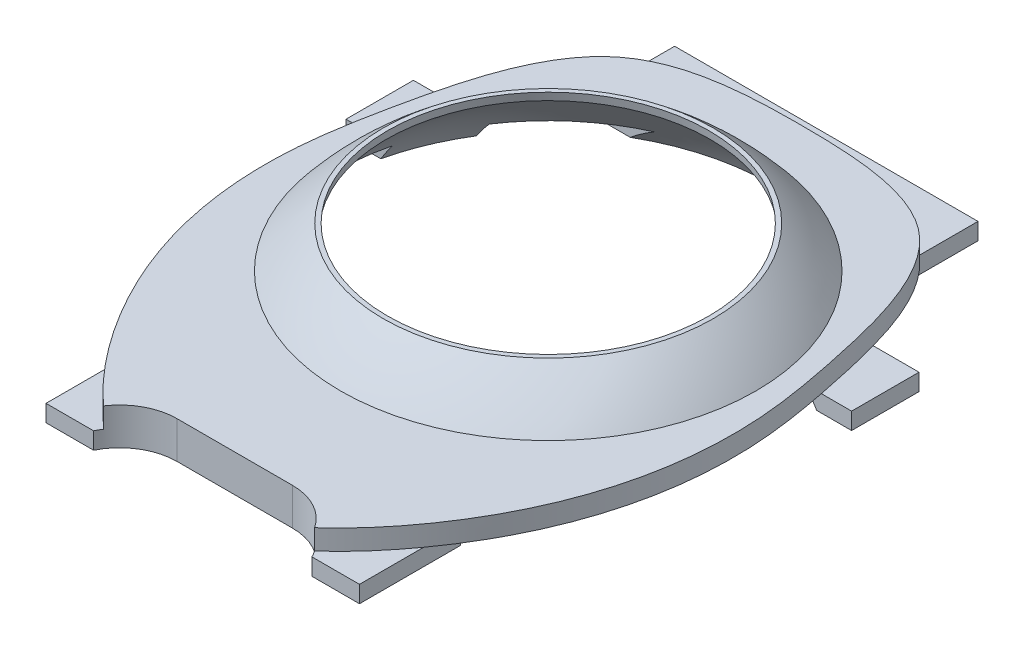
ISO-10303-21;
HEADER;
FILE_DESCRIPTION(('STEP AP214'),'2;1');
FILE_NAME('part.step','',(''),(''),'','','');
FILE_SCHEMA(('AUTOMOTIVE_DESIGN { 1 0 10303 214 1 1 1 1 }'));
ENDSEC;
DATA;
#1=APPLICATION_CONTEXT('core data for automotive mechanical design processes');
#2=APPLICATION_PROTOCOL_DEFINITION('international standard','automotive_design',2000,#1);
#3=PRODUCT_CONTEXT('',#1,'mechanical');
#4=PRODUCT('Part','Part','',(#3));
#5=PRODUCT_RELATED_PRODUCT_CATEGORY('part','',(#4));
#6=PRODUCT_DEFINITION_FORMATION('','',#4);
#7=PRODUCT_DEFINITION_CONTEXT('part definition',#1,'design');
#8=PRODUCT_DEFINITION('design','',#6,#7);
#9=PRODUCT_DEFINITION_SHAPE('','',#8);
#10=(LENGTH_UNIT() NAMED_UNIT(*) SI_UNIT(.MILLI.,.METRE.));
#11=(NAMED_UNIT(*) PLANE_ANGLE_UNIT() SI_UNIT($,.RADIAN.));
#12=(NAMED_UNIT(*) SI_UNIT($,.STERADIAN.) SOLID_ANGLE_UNIT());
#13=UNCERTAINTY_MEASURE_WITH_UNIT(LENGTH_MEASURE(1.E-05),#10,'distance_accuracy_value','');
#14=(GEOMETRIC_REPRESENTATION_CONTEXT(3) GLOBAL_UNCERTAINTY_ASSIGNED_CONTEXT((#13)) GLOBAL_UNIT_ASSIGNED_CONTEXT((#10,
#11,#12)) REPRESENTATION_CONTEXT('',''));
#15=CARTESIAN_POINT('',(0.,0.,0.));
#16=DIRECTION('',(0.,0.,1.));
#17=DIRECTION('',(1.,0.,0.));
#18=AXIS2_PLACEMENT_3D('',#15,#16,#17);
#19=CARTESIAN_POINT('',(-9.3,-1.,-12.5));
#20=DIRECTION('',(0.,0.,1.));
#21=DIRECTION('',(1.,0.,0.));
#22=AXIS2_PLACEMENT_3D('',#19,#20,#21);
#23=PLANE('',#22);
#24=DIRECTION('',(0.,1.,0.));
#25=VECTOR('',#24,1.);
#26=CARTESIAN_POINT('',(-6.47671663584134,-1.,-12.5));
#27=LINE('',#26,#25);
#28=CARTESIAN_POINT('',(-6.47671663584134,0.,-12.5));
#29=VERTEX_POINT('',#28);
#30=CARTESIAN_POINT('',(-6.47671663584134,-1.,-12.5));
#31=VERTEX_POINT('',#30);
#32=EDGE_CURVE('E252',#29,#31,#27,.F.);
#33=ORIENTED_EDGE('',*,*,#32,.F.);
#34=DIRECTION('',(1.,0.,0.));
#35=VECTOR('',#34,1.);
#36=CARTESIAN_POINT('',(-9.3,0.,-12.5));
#37=LINE('',#36,#35);
#38=CARTESIAN_POINT('',(-9.3,0.,-12.5));
#39=VERTEX_POINT('',#38);
#40=EDGE_CURVE('E375',#39,#29,#37,.T.);
#41=ORIENTED_EDGE('',*,*,#40,.F.);
#42=DIRECTION('',(0.,1.,0.));
#43=VECTOR('',#42,1.);
#44=CARTESIAN_POINT('',(-9.3,-1.,-12.5));
#45=LINE('',#44,#43);
#46=CARTESIAN_POINT('',(-9.3,-1.,-12.5));
#47=VERTEX_POINT('',#46);
#48=EDGE_CURVE('E402',#47,#39,#45,.T.);
#49=ORIENTED_EDGE('',*,*,#48,.F.);
#50=DIRECTION('',(1.,0.,0.));
#51=VECTOR('',#50,1.);
#52=CARTESIAN_POINT('',(-9.3,-1.,-12.5));
#53=LINE('',#52,#51);
#54=EDGE_CURVE('E381',#47,#31,#53,.T.);
#55=ORIENTED_EDGE('',*,*,#54,.T.);
#56=EDGE_LOOP('',(#33,#41,#49,#55));
#57=FACE_BOUND('',#56,.T.);
#58=ADVANCED_FACE('F34',(#57),#23,.T.);
#59=CARTESIAN_POINT('',(7.79235748379421,0.,-14.4200576827292));
#60=DIRECTION('',(0.,1.,0.));
#61=DIRECTION('',(0.,0.,1.));
#62=AXIS2_PLACEMENT_3D('',#59,#60,#61);
#63=PLANE('',#62);
#64=CARTESIAN_POINT('',(0.,0.,-33.));
#65=DIRECTION('',(0.,1.,0.));
#66=DIRECTION('',(0.,0.,1.));
#67=AXIS2_PLACEMENT_3D('',#64,#65,#66);
#68=CIRCLE('',#67,12.619429464124);
#69=CARTESIAN_POINT('',(-10.5,0.,-40.));
#70=VERTEX_POINT('',#69);
#71=CARTESIAN_POINT('',(-5.19615242270663,0.,-44.5));
#72=VERTEX_POINT('',#71);
#73=EDGE_CURVE('E271',#70,#72,#68,.F.);
#74=ORIENTED_EDGE('',*,*,#73,.F.);
#75=DIRECTION('',(-1.,0.,0.));
#76=VECTOR('',#75,1.);
#77=CARTESIAN_POINT('',(-15.,0.,-40.));
#78=LINE('',#77,#76);
#79=CARTESIAN_POINT('',(-12.2826332131104,0.,-40.));
#80=VERTEX_POINT('',#79);
#81=EDGE_CURVE('E359',#70,#80,#78,.T.);
#82=ORIENTED_EDGE('',*,*,#81,.T.);
#83=CARTESIAN_POINT('',(-9.,0.,-46.));
#84=CARTESIAN_POINT('',(-11.3387401763922,0.,-44.0845060703049));
#85=CARTESIAN_POINT('',(-12.7787008533567,0.,-38.4434219288769));
#86=CARTESIAN_POINT('',(-14.4585200987064,0.,-29.3625070609101));
#87=CARTESIAN_POINT('',(-12.4747201103991,0.,-18.569421958163));
#88=CARTESIAN_POINT('',(0.,0.,-5.57285096827777));
#89=CARTESIAN_POINT('',(12.4747201103991,0.,-18.569421958163));
#90=CARTESIAN_POINT('',(14.4585200987064,0.,-29.3625070609101));
#91=CARTESIAN_POINT('',(12.7787008533567,0.,-38.4434219288769));
#92=CARTESIAN_POINT('',(10.4484921966989,0.,-47.5720761411578));
#93=CARTESIAN_POINT('',(0.,0.,-48.2069005566028));
#94=CARTESIAN_POINT('',(-6.81069851304249,0.,-47.7930994433972));
#95=CARTESIAN_POINT('',(-9.,0.,-46.));
#96=B_SPLINE_CURVE_WITH_KNOTS('',3,(#83,#84,#85,#86,#87,#88,#89,#90,#91,#92,#93,#94,#95),
.UNSPECIFIED.,.T.,.F.,(4,1,1,1,1,1,1,1,1,1,4),(0.,0.0953555966733004,0.144380791847986,
0.273131780923332,0.410737348383601,0.54834291584387,0.677093904919215,0.726119100093901,
0.821474696767201,0.910737348383601,1.),.UNSPECIFIED.);
#97=CARTESIAN_POINT('',(-9.,0.,-46.));
#98=VERTEX_POINT('',#97);
#99=EDGE_CURVE('E572',#98,#80,#96,.T.);
#100=ORIENTED_EDGE('',*,*,#99,.F.);
#101=DIRECTION('',(0.,0.,1.));
#102=VECTOR('',#101,1.);
#103=CARTESIAN_POINT('',(-9.00000000000001,0.,-49.5));
#104=LINE('',#103,#102);
#105=CARTESIAN_POINT('',(-9.00000000000001,0.,-44.5));
#106=VERTEX_POINT('',#105);
#107=EDGE_CURVE('E333',#98,#106,#104,.T.);
#108=ORIENTED_EDGE('',*,*,#107,.T.);
#109=DIRECTION('',(1.,0.,0.));
#110=VECTOR('',#109,1.);
#111=CARTESIAN_POINT('',(-9.00000000000001,0.,-44.5));
#112=LINE('',#111,#110);
#113=EDGE_CURVE('E316',#106,#72,#112,.T.);
#114=ORIENTED_EDGE('',*,*,#113,.T.);
#115=EDGE_LOOP('',(#74,#82,#100,#108,#114));
#116=FACE_BOUND('',#115,.T.);
#117=ADVANCED_FACE('F427',(#116),#63,.F.);
#118=CARTESIAN_POINT('',(5.19615242270663,0.,-44.5));
#119=VERTEX_POINT('',#118);
#120=CARTESIAN_POINT('',(10.5,0.,-40.));
#121=VERTEX_POINT('',#120);
#122=EDGE_CURVE('E270',#119,#121,#68,.F.);
#123=ORIENTED_EDGE('',*,*,#122,.F.);
#124=CARTESIAN_POINT('',(8.99999999999999,0.,-44.5));
#125=VERTEX_POINT('',#124);
#126=EDGE_CURVE('E336',#119,#125,#112,.T.);
#127=ORIENTED_EDGE('',*,*,#126,.T.);
#128=DIRECTION('',(0.,0.,-1.));
#129=VECTOR('',#128,1.);
#130=CARTESIAN_POINT('',(8.99999999999999,0.,-49.5));
#131=LINE('',#130,#129);
#132=CARTESIAN_POINT('',(8.99999999999999,0.,-45.9999999999891));
#133=VERTEX_POINT('',#132);
#134=EDGE_CURVE('E327',#125,#133,#131,.T.);
#135=ORIENTED_EDGE('',*,*,#134,.T.);
#136=CARTESIAN_POINT('',(12.2826332131104,0.,-40.0000000000009));
#137=VERTEX_POINT('',#136);
#138=EDGE_CURVE('E566',#137,#133,#96,.T.);
#139=ORIENTED_EDGE('',*,*,#138,.F.);
#140=DIRECTION('',(-1.,0.,0.));
#141=VECTOR('',#140,1.);
#142=CARTESIAN_POINT('',(9.99999999999999,0.,-40.));
#143=LINE('',#142,#141);
#144=EDGE_CURVE('E302',#137,#121,#143,.T.);
#145=ORIENTED_EDGE('',*,*,#144,.T.);
#146=EDGE_LOOP('',(#123,#127,#135,#139,#145));
#147=FACE_BOUND('',#146,.T.);
#148=ADVANCED_FACE('F430',(#147),#63,.F.);
#149=CARTESIAN_POINT('',(-9.00000000000001,-1.,-44.5));
#150=DIRECTION('',(0.,0.,1.));
#151=DIRECTION('',(1.,0.,0.));
#152=AXIS2_PLACEMENT_3D('',#149,#150,#151);
#153=PLANE('',#152);
#154=DIRECTION('',(1.,0.,0.));
#155=VECTOR('',#154,1.);
#156=CARTESIAN_POINT('',(-9.00000000000001,-1.,-44.5));
#157=LINE('',#156,#155);
#158=CARTESIAN_POINT('',(-9.00000000000001,-1.,-44.5));
#159=VERTEX_POINT('',#158);
#160=CARTESIAN_POINT('',(-6.63324958071079,-0.999999999999999,-44.5));
#161=VERTEX_POINT('',#160);
#162=EDGE_CURVE('E323',#159,#161,#157,.T.);
#163=ORIENTED_EDGE('',*,*,#162,.T.);
#164=CARTESIAN_POINT('',(0.,-9.,-44.5));
#165=DIRECTION('',(0.,0.,1.));
#166=DIRECTION('',(1.,0.,0.));
#167=AXIS2_PLACEMENT_3D('',#164,#165,#166);
#168=CIRCLE('',#167,10.3923048454133);
#169=EDGE_CURVE('E276',#161,#72,#168,.F.);
#170=ORIENTED_EDGE('',*,*,#169,.T.);
#171=ORIENTED_EDGE('',*,*,#113,.F.);
#172=DIRECTION('',(0.,1.,0.));
#173=VECTOR('',#172,1.);
#174=CARTESIAN_POINT('',(-9.00000000000001,-1.,-44.5));
#175=LINE('',#174,#173);
#176=EDGE_CURVE('E343',#159,#106,#175,.T.);
#177=ORIENTED_EDGE('',*,*,#176,.F.);
#178=EDGE_LOOP('',(#163,#170,#171,#177));
#179=FACE_BOUND('',#178,.T.);
#180=ADVANCED_FACE('F496',(#179),#153,.T.);
#181=CARTESIAN_POINT('',(12.2576506721313,0.,-36.));
#182=VERTEX_POINT('',#181);
#183=CARTESIAN_POINT('',(-12.2576506721313,0.,-36.));
#184=VERTEX_POINT('',#183);
#185=EDGE_CURVE('E268',#182,#184,#68,.F.);
#186=ORIENTED_EDGE('',*,*,#185,.F.);
#187=DIRECTION('',(1.,0.,0.));
#188=VECTOR('',#187,1.);
#189=CARTESIAN_POINT('',(9.99999999999999,0.,-36.));
#190=LINE('',#189,#188);
#191=CARTESIAN_POINT('',(13.2055833160533,0.,-36.));
#192=VERTEX_POINT('',#191);
#193=EDGE_CURVE('E294',#182,#192,#190,.T.);
#194=ORIENTED_EDGE('',*,*,#193,.T.);
#195=CARTESIAN_POINT('',(9.3,0.,-16.3032130486104));
#196=VERTEX_POINT('',#195);
#197=EDGE_CURVE('E565',#196,#192,#96,.T.);
#198=ORIENTED_EDGE('',*,*,#197,.F.);
#199=DIRECTION('',(0.,0.,-1.));
#200=VECTOR('',#199,1.);
#201=CARTESIAN_POINT('',(9.3,0.,-12.5));
#202=LINE('',#201,#200);
#203=CARTESIAN_POINT('',(9.3,0.,-18.5));
#204=VERTEX_POINT('',#203);
#205=EDGE_CURVE('E388',#196,#204,#202,.T.);
#206=ORIENTED_EDGE('',*,*,#205,.T.);
#207=DIRECTION('',(-1.,0.,0.));
#208=VECTOR('',#207,1.);
#209=CARTESIAN_POINT('',(-9.3,0.,-18.5));
#210=LINE('',#209,#208);
#211=CARTESIAN_POINT('',(-9.3,0.,-18.5));
#212=VERTEX_POINT('',#211);
#213=EDGE_CURVE('E387',#204,#212,#210,.T.);
#214=ORIENTED_EDGE('',*,*,#213,.T.);
#215=DIRECTION('',(0.,0.,1.));
#216=VECTOR('',#215,1.);
#217=CARTESIAN_POINT('',(-9.3,0.,-12.5));
#218=LINE('',#217,#216);
#219=CARTESIAN_POINT('',(-9.3,0.,-16.30321304164));
#220=VERTEX_POINT('',#219);
#221=EDGE_CURVE('E392',#212,#220,#218,.T.);
#222=ORIENTED_EDGE('',*,*,#221,.T.);
#223=CARTESIAN_POINT('',(-13.2055833160533,0.,-35.9999999871215));
#224=VERTEX_POINT('',#223);
#225=EDGE_CURVE('E401',#224,#220,#96,.T.);
#226=ORIENTED_EDGE('',*,*,#225,.F.);
#227=DIRECTION('',(1.,0.,0.));
#228=VECTOR('',#227,1.);
#229=CARTESIAN_POINT('',(-15.,0.,-36.));
#230=LINE('',#229,#228);
#231=EDGE_CURVE('E364',#224,#184,#230,.T.);
#232=ORIENTED_EDGE('',*,*,#231,.T.);
#233=EDGE_LOOP('',(#186,#194,#198,#206,#214,#222,#226,#232));
#234=FACE_BOUND('',#233,.T.);
#235=ADVANCED_FACE('F425',(#234),#63,.F.);
#236=CARTESIAN_POINT('',(-9.,1.2,-46.));
#237=CARTESIAN_POINT('',(-11.3387401763922,1.2,-44.0845060703049));
#238=CARTESIAN_POINT('',(-12.7787008533567,1.2,-38.4434219288769));
#239=CARTESIAN_POINT('',(-14.4585200987064,1.2,-29.3625070609101));
#240=CARTESIAN_POINT('',(-12.4747201103991,1.2,-18.569421958163));
#241=CARTESIAN_POINT('',(0.,1.2,-5.57285096827777));
#242=CARTESIAN_POINT('',(12.4747201103991,1.2,-18.569421958163));
#243=CARTESIAN_POINT('',(14.4585200987064,1.2,-29.3625070609101));
#244=CARTESIAN_POINT('',(12.7787008533567,1.2,-38.4434219288769));
#245=CARTESIAN_POINT('',(10.4484921966989,1.2,-47.5720761411578));
#246=CARTESIAN_POINT('',(0.,1.2,-48.2069005566028));
#247=CARTESIAN_POINT('',(-6.81069851304249,1.2,-47.7930994433972));
#248=CARTESIAN_POINT('',(-9.,1.2,-46.));
#249=B_SPLINE_CURVE_WITH_KNOTS('',3,(#236,#237,#238,#239,#240,#241,#242,#243,#244,#245,#246,
#247,#248),.UNSPECIFIED.,.T.,.F.,(4,1,1,1,1,1,1,1,1,1,4),(0.,0.0953555966733004,
0.144380791847986,0.273131780923332,0.410737348383601,0.54834291584387,0.677093904919215,
0.726119100093901,0.821474696767201,0.910737348383601,1.),.UNSPECIFIED.);
#250=DIRECTION('',(0.,-1.,0.));
#251=VECTOR('',#250,1.);
#252=SURFACE_OF_LINEAR_EXTRUSION('',#249,#251);
#253=CARTESIAN_POINT('',(-6.25988956536932,0.,-12.8778083569115));
#254=VERTEX_POINT('',#253);
#255=EDGE_CURVE('E414',#220,#254,#96,.T.);
#256=ORIENTED_EDGE('',*,*,#255,.T.);
#257=DIRECTION('',(0.,-1.,0.));
#258=VECTOR('',#257,1.);
#259=CARTESIAN_POINT('',(-6.25988956536932,1.2,-12.8778083569115));
#260=LINE('',#259,#258);
#261=CARTESIAN_POINT('',(-6.25988956536932,1.2,-12.8778083569115));
#262=VERTEX_POINT('',#261);
#263=EDGE_CURVE('E257',#254,#262,#260,.F.);
#264=ORIENTED_EDGE('',*,*,#263,.T.);
#265=CARTESIAN_POINT('',(6.25988956536931,1.2,-12.8778083569115));
#266=VERTEX_POINT('',#265);
#267=EDGE_CURVE('E408',#266,#262,#249,.T.);
#268=ORIENTED_EDGE('',*,*,#267,.F.);
#269=DIRECTION('',(0.,-1.,0.));
#270=VECTOR('',#269,1.);
#271=CARTESIAN_POINT('',(6.25988956536931,1.2,-12.8778083569115));
#272=LINE('',#271,#270);
#273=CARTESIAN_POINT('',(6.25988956536932,0.,-12.8778083569115));
#274=VERTEX_POINT('',#273);
#275=EDGE_CURVE('E246',#266,#274,#272,.T.);
#276=ORIENTED_EDGE('',*,*,#275,.T.);
#277=EDGE_CURVE('E564',#274,#196,#96,.T.);
#278=ORIENTED_EDGE('',*,*,#277,.T.);
#279=ORIENTED_EDGE('',*,*,#197,.T.);
#280=EDGE_CURVE('E568',#192,#137,#96,.T.);
#281=ORIENTED_EDGE('',*,*,#280,.T.);
#282=ORIENTED_EDGE('',*,*,#138,.T.);
#283=EDGE_CURVE('E575',#133,#98,#96,.T.);
#284=ORIENTED_EDGE('',*,*,#283,.T.);
#285=ORIENTED_EDGE('',*,*,#99,.T.);
#286=EDGE_CURVE('E569',#80,#224,#96,.T.);
#287=ORIENTED_EDGE('',*,*,#286,.T.);
#288=ORIENTED_EDGE('',*,*,#225,.T.);
#289=EDGE_LOOP('',(#256,#264,#268,#276,#278,#279,#281,#282,#284,#285,#287,#288));
#290=FACE_BOUND('',#289,.T.);
#291=ADVANCED_FACE('F421',(#290),#252,.F.);
#292=CARTESIAN_POINT('',(7.79235748379421,1.2,-14.4200576827292));
#293=DIRECTION('',(0.,1.,0.));
#294=DIRECTION('',(0.,0.,1.));
#295=AXIS2_PLACEMENT_3D('',#292,#293,#294);
#296=PLANE('',#295);
#297=CARTESIAN_POINT('',(-3.42548737536287,1.2,-11.));
#298=DIRECTION('',(0.,1.,0.));
#299=DIRECTION('',(0.,0.,1.));
#300=AXIS2_PLACEMENT_3D('',#297,#298,#299);
#301=CIRCLE('',#300,3.4);
#302=CARTESIAN_POINT('',(-3.42548737536287,1.2,-14.4));
#303=VERTEX_POINT('',#302);
#304=EDGE_CURVE('E260',#303,#262,#301,.T.);
#305=ORIENTED_EDGE('',*,*,#304,.F.);
#306=DIRECTION('',(-1.,0.,0.));
#307=VECTOR('',#306,1.);
#308=CARTESIAN_POINT('',(7.79235748379421,1.2,-14.4));
#309=LINE('',#308,#307);
#310=CARTESIAN_POINT('',(3.42548737536287,1.2,-14.4));
#311=VERTEX_POINT('',#310);
#312=EDGE_CURVE('E250',#311,#303,#309,.T.);
#313=ORIENTED_EDGE('',*,*,#312,.F.);
#314=CARTESIAN_POINT('',(3.42548737536287,1.2,-11.));
#315=DIRECTION('',(0.,1.,0.));
#316=DIRECTION('',(0.,0.,1.));
#317=AXIS2_PLACEMENT_3D('',#314,#315,#316);
#318=CIRCLE('',#317,3.4);
#319=EDGE_CURVE('E223',#266,#311,#318,.T.);
#320=ORIENTED_EDGE('',*,*,#319,.F.);
#321=ORIENTED_EDGE('',*,*,#267,.T.);
#322=EDGE_LOOP('',(#305,#313,#320,#321));
#323=FACE_BOUND('',#322,.T.);
#324=CARTESIAN_POINT('',(0.,1.2,-33.));
#325=DIRECTION('',(0.,1.,0.));
#326=DIRECTION('',(0.,0.,1.));
#327=AXIS2_PLACEMENT_3D('',#324,#325,#326);
#328=CIRCLE('',#327,12.327205684988);
#329=CARTESIAN_POINT('',(12.327205684988,1.2,-33.));
#330=VERTEX_POINT('',#329);
#331=EDGE_CURVE('E617',#330,#330,#328,.T.);
#332=ORIENTED_EDGE('',*,*,#331,.F.);
#333=EDGE_LOOP('',(#332));
#334=FACE_BOUND('',#333,.T.);
#335=ADVANCED_FACE('F424',(#323,#334),#296,.T.);
#336=CARTESIAN_POINT('',(0.,0.,0.));
#337=DIRECTION('',(0.,-1.,0.));
#338=DIRECTION('',(0.,0.,-1.));
#339=AXIS2_PLACEMENT_3D('',#336,#337,#338);
#340=PLANE('',#339);
#341=ORIENTED_EDGE('',*,*,#40,.T.);
#342=CARTESIAN_POINT('',(-3.42548737536287,0.,-11.));
#343=DIRECTION('',(0.,-1.,0.));
#344=DIRECTION('',(0.,0.,-1.));
#345=AXIS2_PLACEMENT_3D('',#342,#343,#344);
#346=CIRCLE('',#345,3.4);
#347=EDGE_CURVE('E254',#29,#254,#346,.T.);
#348=ORIENTED_EDGE('',*,*,#347,.T.);
#349=ORIENTED_EDGE('',*,*,#255,.F.);
#350=EDGE_CURVE('E391',#220,#39,#218,.T.);
#351=ORIENTED_EDGE('',*,*,#350,.T.);
#352=EDGE_LOOP('',(#341,#348,#349,#351));
#353=FACE_BOUND('',#352,.T.);
#354=ADVANCED_FACE('F434',(#353),#340,.F.);
#355=CARTESIAN_POINT('',(9.3,-1.,-12.5));
#356=DIRECTION('',(1.,0.,0.));
#357=DIRECTION('',(0.,0.,-1.));
#358=AXIS2_PLACEMENT_3D('',#355,#356,#357);
#359=PLANE('',#358);
#360=CARTESIAN_POINT('',(9.3,0.,-12.5));
#361=VERTEX_POINT('',#360);
#362=EDGE_CURVE('E368',#361,#196,#202,.T.);
#363=ORIENTED_EDGE('',*,*,#362,.F.);
#364=DIRECTION('',(0.,1.,0.));
#365=VECTOR('',#364,1.);
#366=CARTESIAN_POINT('',(9.3,-1.,-12.5));
#367=LINE('',#366,#365);
#368=CARTESIAN_POINT('',(9.3,-1.,-12.5));
#369=VERTEX_POINT('',#368);
#370=EDGE_CURVE('E398',#369,#361,#367,.T.);
#371=ORIENTED_EDGE('',*,*,#370,.F.);
#372=DIRECTION('',(0.,0.,-1.));
#373=VECTOR('',#372,1.);
#374=CARTESIAN_POINT('',(9.3,-1.,-12.5));
#375=LINE('',#374,#373);
#376=CARTESIAN_POINT('',(9.3,-1.,-18.5));
#377=VERTEX_POINT('',#376);
#378=EDGE_CURVE('E371',#369,#377,#375,.T.);
#379=ORIENTED_EDGE('',*,*,#378,.T.);
#380=DIRECTION('',(0.,1.,0.));
#381=VECTOR('',#380,1.);
#382=CARTESIAN_POINT('',(9.3,-1.,-18.5));
#383=LINE('',#382,#381);
#384=EDGE_CURVE('E384',#377,#204,#383,.T.);
#385=ORIENTED_EDGE('',*,*,#384,.T.);
#386=ORIENTED_EDGE('',*,*,#205,.F.);
#387=EDGE_LOOP('',(#363,#371,#379,#385,#386));
#388=FACE_BOUND('',#387,.T.);
#389=ADVANCED_FACE('F436',(#388),#359,.T.);
#390=DIRECTION('',(0.,1.,0.));
#391=VECTOR('',#390,1.);
#392=CARTESIAN_POINT('',(6.47671663584135,-1.,-12.5));
#393=LINE('',#392,#391);
#394=CARTESIAN_POINT('',(6.47671663584135,-1.,-12.5));
#395=VERTEX_POINT('',#394);
#396=CARTESIAN_POINT('',(6.47671663584135,0.,-12.5));
#397=VERTEX_POINT('',#396);
#398=EDGE_CURVE('E50',#395,#397,#393,.T.);
#399=ORIENTED_EDGE('',*,*,#398,.F.);
#400=EDGE_CURVE('E239',#395,#369,#53,.T.);
#401=ORIENTED_EDGE('',*,*,#400,.T.);
#402=ORIENTED_EDGE('',*,*,#370,.T.);
#403=EDGE_CURVE('E395',#397,#361,#37,.T.);
#404=ORIENTED_EDGE('',*,*,#403,.F.);
#405=EDGE_LOOP('',(#399,#401,#402,#404));
#406=FACE_BOUND('',#405,.T.);
#407=ADVANCED_FACE('F439',(#406),#23,.T.);
#408=CARTESIAN_POINT('',(-9.3,-1.,-12.5));
#409=DIRECTION('',(-1.,0.,0.));
#410=DIRECTION('',(0.,0.,1.));
#411=AXIS2_PLACEMENT_3D('',#408,#409,#410);
#412=PLANE('',#411);
#413=ORIENTED_EDGE('',*,*,#221,.F.);
#414=DIRECTION('',(0.,1.,0.));
#415=VECTOR('',#414,1.);
#416=CARTESIAN_POINT('',(-9.3,-1.,-18.5));
#417=LINE('',#416,#415);
#418=CARTESIAN_POINT('',(-9.3,-1.,-18.5));
#419=VERTEX_POINT('',#418);
#420=EDGE_CURVE('E405',#419,#212,#417,.T.);
#421=ORIENTED_EDGE('',*,*,#420,.F.);
#422=DIRECTION('',(0.,0.,1.));
#423=VECTOR('',#422,1.);
#424=CARTESIAN_POINT('',(-9.3,-1.,-12.5));
#425=LINE('',#424,#423);
#426=EDGE_CURVE('E378',#419,#47,#425,.T.);
#427=ORIENTED_EDGE('',*,*,#426,.T.);
#428=ORIENTED_EDGE('',*,*,#48,.T.);
#429=ORIENTED_EDGE('',*,*,#350,.F.);
#430=EDGE_LOOP('',(#413,#421,#427,#428,#429));
#431=FACE_BOUND('',#430,.T.);
#432=ADVANCED_FACE('F444',(#431),#412,.T.);
#433=CARTESIAN_POINT('',(-9.3,-1.,-18.5));
#434=DIRECTION('',(0.,0.,-1.));
#435=DIRECTION('',(-1.,0.,0.));
#436=AXIS2_PLACEMENT_3D('',#433,#434,#435);
#437=PLANE('',#436);
#438=ORIENTED_EDGE('',*,*,#213,.F.);
#439=ORIENTED_EDGE('',*,*,#384,.F.);
#440=DIRECTION('',(-1.,0.,0.));
#441=VECTOR('',#440,1.);
#442=CARTESIAN_POINT('',(-9.3,-1.,-18.5));
#443=LINE('',#442,#441);
#444=EDGE_CURVE('E374',#377,#419,#443,.T.);
#445=ORIENTED_EDGE('',*,*,#444,.T.);
#446=ORIENTED_EDGE('',*,*,#420,.T.);
#447=EDGE_LOOP('',(#438,#439,#445,#446));
#448=FACE_BOUND('',#447,.T.);
#449=ADVANCED_FACE('F441',(#448),#437,.T.);
#450=CARTESIAN_POINT('',(0.,-1.,0.));
#451=DIRECTION('',(0.,-1.,0.));
#452=DIRECTION('',(0.,0.,-1.));
#453=AXIS2_PLACEMENT_3D('',#450,#451,#452);
#454=PLANE('',#453);
#455=CARTESIAN_POINT('',(-3.42548737536287,-1.,-11.));
#456=DIRECTION('',(0.,1.,0.));
#457=DIRECTION('',(0.,0.,-1.));
#458=AXIS2_PLACEMENT_3D('',#455,#456,#457);
#459=CIRCLE('',#458,3.4);
#460=CARTESIAN_POINT('',(-3.42548737536287,-1.,-14.4));
#461=VERTEX_POINT('',#460);
#462=EDGE_CURVE('E240',#461,#31,#459,.T.);
#463=ORIENTED_EDGE('',*,*,#462,.T.);
#464=ORIENTED_EDGE('',*,*,#54,.F.);
#465=ORIENTED_EDGE('',*,*,#426,.F.);
#466=ORIENTED_EDGE('',*,*,#444,.F.);
#467=ORIENTED_EDGE('',*,*,#378,.F.);
#468=ORIENTED_EDGE('',*,*,#400,.F.);
#469=CARTESIAN_POINT('',(3.42548737536287,-1.,-11.));
#470=DIRECTION('',(0.,1.,0.));
#471=DIRECTION('',(0.,0.,-1.));
#472=AXIS2_PLACEMENT_3D('',#469,#470,#471);
#473=CIRCLE('',#472,3.4);
#474=CARTESIAN_POINT('',(3.42548737536287,-1.,-14.4));
#475=VERTEX_POINT('',#474);
#476=EDGE_CURVE('E221',#395,#475,#473,.T.);
#477=ORIENTED_EDGE('',*,*,#476,.T.);
#478=DIRECTION('',(-1.,0.,0.));
#479=VECTOR('',#478,1.);
#480=CARTESIAN_POINT('',(-3.42548737536287,-1.,-14.4));
#481=LINE('',#480,#479);
#482=EDGE_CURVE('E227',#475,#461,#481,.T.);
#483=ORIENTED_EDGE('',*,*,#482,.T.);
#484=EDGE_LOOP('',(#463,#464,#465,#466,#467,#468,#477,#483));
#485=FACE_BOUND('',#484,.T.);
#486=ADVANCED_FACE('F237',(#485),#454,.T.);
#487=ORIENTED_EDGE('',*,*,#277,.F.);
#488=CARTESIAN_POINT('',(3.42548737536287,0.,-11.));
#489=DIRECTION('',(0.,-1.,0.));
#490=DIRECTION('',(0.,0.,-1.));
#491=AXIS2_PLACEMENT_3D('',#488,#489,#490);
#492=CIRCLE('',#491,3.4);
#493=EDGE_CURVE('E11',#274,#397,#492,.T.);
#494=ORIENTED_EDGE('',*,*,#493,.T.);
#495=ORIENTED_EDGE('',*,*,#403,.T.);
#496=ORIENTED_EDGE('',*,*,#362,.T.);
#497=EDGE_LOOP('',(#487,#494,#495,#496));
#498=FACE_BOUND('',#497,.T.);
#499=ADVANCED_FACE('F452',(#498),#340,.F.);
#500=CARTESIAN_POINT('',(0.,0.,0.));
#501=DIRECTION('',(0.,1.,0.));
#502=DIRECTION('',(0.,0.,1.));
#503=AXIS2_PLACEMENT_3D('',#500,#501,#502);
#504=PLANE('',#503);
#505=ORIENTED_EDGE('',*,*,#286,.F.);
#506=CARTESIAN_POINT('',(-15.,0.,-40.));
#507=VERTEX_POINT('',#506);
#508=EDGE_CURVE('E342',#80,#507,#78,.T.);
#509=ORIENTED_EDGE('',*,*,#508,.T.);
#510=DIRECTION('',(0.,0.,1.));
#511=VECTOR('',#510,1.);
#512=CARTESIAN_POINT('',(-15.,0.,-40.));
#513=LINE('',#512,#511);
#514=CARTESIAN_POINT('',(-15.,0.,-36.));
#515=VERTEX_POINT('',#514);
#516=EDGE_CURVE('E361',#507,#515,#513,.T.);
#517=ORIENTED_EDGE('',*,*,#516,.T.);
#518=EDGE_CURVE('E352',#515,#224,#230,.T.);
#519=ORIENTED_EDGE('',*,*,#518,.T.);
#520=EDGE_LOOP('',(#505,#509,#517,#519));
#521=FACE_BOUND('',#520,.T.);
#522=ADVANCED_FACE('F455',(#521),#504,.T.);
#523=CARTESIAN_POINT('',(-15.,-1.,-36.));
#524=DIRECTION('',(0.,0.,1.));
#525=DIRECTION('',(1.,0.,0.));
#526=AXIS2_PLACEMENT_3D('',#523,#524,#525);
#527=PLANE('',#526);
#528=DIRECTION('',(1.,0.,0.));
#529=VECTOR('',#528,1.);
#530=CARTESIAN_POINT('',(-15.,-1.,-36.));
#531=LINE('',#530,#529);
#532=CARTESIAN_POINT('',(-15.,-1.,-36.));
#533=VERTEX_POINT('',#532);
#534=CARTESIAN_POINT('',(-12.9325171563776,-0.999999999999999,-36.));
#535=VERTEX_POINT('',#534);
#536=EDGE_CURVE('E355',#533,#535,#531,.T.);
#537=ORIENTED_EDGE('',*,*,#536,.T.);
#538=CARTESIAN_POINT('',(0.,-9.,-36.));
#539=DIRECTION('',(0.,0.,1.));
#540=DIRECTION('',(1.,0.,0.));
#541=AXIS2_PLACEMENT_3D('',#538,#539,#540);
#542=CIRCLE('',#541,15.2069063257455);
#543=EDGE_CURVE('E275',#535,#184,#542,.F.);
#544=ORIENTED_EDGE('',*,*,#543,.T.);
#545=ORIENTED_EDGE('',*,*,#231,.F.);
#546=ORIENTED_EDGE('',*,*,#518,.F.);
#547=DIRECTION('',(0.,1.,0.));
#548=VECTOR('',#547,1.);
#549=CARTESIAN_POINT('',(-15.,-1.,-36.));
#550=LINE('',#549,#548);
#551=EDGE_CURVE('E366',#533,#515,#550,.T.);
#552=ORIENTED_EDGE('',*,*,#551,.F.);
#553=EDGE_LOOP('',(#537,#544,#545,#546,#552));
#554=FACE_BOUND('',#553,.T.);
#555=ADVANCED_FACE('F467',(#554),#527,.T.);
#556=CARTESIAN_POINT('',(-15.,-1.,-40.));
#557=DIRECTION('',(-1.,0.,0.));
#558=DIRECTION('',(0.,0.,1.));
#559=AXIS2_PLACEMENT_3D('',#556,#557,#558);
#560=PLANE('',#559);
#561=ORIENTED_EDGE('',*,*,#516,.F.);
#562=DIRECTION('',(0.,1.,0.));
#563=VECTOR('',#562,1.);
#564=CARTESIAN_POINT('',(-15.,-1.,-40.));
#565=LINE('',#564,#563);
#566=CARTESIAN_POINT('',(-15.,-1.,-40.));
#567=VERTEX_POINT('',#566);
#568=EDGE_CURVE('E358',#567,#507,#565,.T.);
#569=ORIENTED_EDGE('',*,*,#568,.F.);
#570=DIRECTION('',(0.,0.,1.));
#571=VECTOR('',#570,1.);
#572=CARTESIAN_POINT('',(-15.,-1.,-40.));
#573=LINE('',#572,#571);
#574=EDGE_CURVE('E351',#567,#533,#573,.T.);
#575=ORIENTED_EDGE('',*,*,#574,.T.);
#576=ORIENTED_EDGE('',*,*,#551,.T.);
#577=EDGE_LOOP('',(#561,#569,#575,#576));
#578=FACE_BOUND('',#577,.T.);
#579=ADVANCED_FACE('F463',(#578),#560,.T.);
#580=CARTESIAN_POINT('',(-15.,-1.,-40.));
#581=DIRECTION('',(0.,0.,-1.));
#582=DIRECTION('',(-1.,0.,0.));
#583=AXIS2_PLACEMENT_3D('',#580,#581,#582);
#584=PLANE('',#583);
#585=ORIENTED_EDGE('',*,*,#81,.F.);
#586=CARTESIAN_POINT('',(0.,-9.,-40.));
#587=DIRECTION('',(0.,0.,-1.));
#588=DIRECTION('',(-1.,0.,0.));
#589=AXIS2_PLACEMENT_3D('',#586,#587,#588);
#590=CIRCLE('',#589,13.8293166859393);
#591=CARTESIAN_POINT('',(-11.2805141726785,-0.999999999999999,-40.));
#592=VERTEX_POINT('',#591);
#593=EDGE_CURVE('E283',#70,#592,#590,.F.);
#594=ORIENTED_EDGE('',*,*,#593,.T.);
#595=DIRECTION('',(-1.,0.,0.));
#596=VECTOR('',#595,1.);
#597=CARTESIAN_POINT('',(-15.,-1.,-40.));
#598=LINE('',#597,#596);
#599=EDGE_CURVE('E349',#592,#567,#598,.T.);
#600=ORIENTED_EDGE('',*,*,#599,.T.);
#601=ORIENTED_EDGE('',*,*,#568,.T.);
#602=ORIENTED_EDGE('',*,*,#508,.F.);
#603=EDGE_LOOP('',(#585,#594,#600,#601,#602));
#604=FACE_BOUND('',#603,.T.);
#605=ADVANCED_FACE('F459',(#604),#584,.T.);
#606=CARTESIAN_POINT('',(0.,-1.,0.));
#607=DIRECTION('',(0.,1.,0.));
#608=DIRECTION('',(0.,0.,1.));
#609=AXIS2_PLACEMENT_3D('',#606,#607,#608);
#610=PLANE('',#609);
#611=CARTESIAN_POINT('',(0.,-0.999999999999999,-33.));
#612=DIRECTION('',(0.,1.,0.));
#613=DIRECTION('',(0.,0.,1.));
#614=AXIS2_PLACEMENT_3D('',#611,#612,#613);
#615=CIRCLE('',#614,13.2759180473518);
#616=EDGE_CURVE('E281',#535,#592,#615,.F.);
#617=ORIENTED_EDGE('',*,*,#616,.F.);
#618=ORIENTED_EDGE('',*,*,#536,.F.);
#619=ORIENTED_EDGE('',*,*,#574,.F.);
#620=ORIENTED_EDGE('',*,*,#599,.F.);
#621=EDGE_LOOP('',(#617,#618,#619,#620));
#622=FACE_BOUND('',#621,.T.);
#623=ADVANCED_FACE('F462',(#622),#610,.F.);
#624=CARTESIAN_POINT('',(0.,0.,0.));
#625=DIRECTION('',(0.,1.,0.));
#626=DIRECTION('',(0.,0.,1.));
#627=AXIS2_PLACEMENT_3D('',#624,#625,#626);
#628=PLANE('',#627);
#629=ORIENTED_EDGE('',*,*,#283,.F.);
#630=CARTESIAN_POINT('',(8.99999999999999,0.,-49.5));
#631=VERTEX_POINT('',#630);
#632=EDGE_CURVE('E310',#133,#631,#131,.T.);
#633=ORIENTED_EDGE('',*,*,#632,.T.);
#634=DIRECTION('',(-1.,0.,0.));
#635=VECTOR('',#634,1.);
#636=CARTESIAN_POINT('',(-9.00000000000001,0.,-49.5));
#637=LINE('',#636,#635);
#638=CARTESIAN_POINT('',(-9.00000000000001,0.,-49.5));
#639=VERTEX_POINT('',#638);
#640=EDGE_CURVE('E330',#631,#639,#637,.T.);
#641=ORIENTED_EDGE('',*,*,#640,.T.);
#642=EDGE_CURVE('E334',#639,#98,#104,.T.);
#643=ORIENTED_EDGE('',*,*,#642,.T.);
#644=EDGE_LOOP('',(#629,#633,#641,#643));
#645=FACE_BOUND('',#644,.T.);
#646=ADVANCED_FACE('F477',(#645),#628,.T.);
#647=CARTESIAN_POINT('',(8.99999999999999,-1.,-49.5));
#648=DIRECTION('',(1.,0.,0.));
#649=DIRECTION('',(0.,0.,-1.));
#650=AXIS2_PLACEMENT_3D('',#647,#648,#649);
#651=PLANE('',#650);
#652=ORIENTED_EDGE('',*,*,#134,.F.);
#653=DIRECTION('',(0.,1.,0.));
#654=VECTOR('',#653,1.);
#655=CARTESIAN_POINT('',(8.99999999999999,-1.,-44.5));
#656=LINE('',#655,#654);
#657=CARTESIAN_POINT('',(8.99999999999999,-1.,-44.5));
#658=VERTEX_POINT('',#657);
#659=EDGE_CURVE('E339',#658,#125,#656,.T.);
#660=ORIENTED_EDGE('',*,*,#659,.F.);
#661=DIRECTION('',(0.,0.,-1.));
#662=VECTOR('',#661,1.);
#663=CARTESIAN_POINT('',(8.99999999999999,-1.,-49.5));
#664=LINE('',#663,#662);
#665=CARTESIAN_POINT('',(8.99999999999999,-1.,-49.5));
#666=VERTEX_POINT('',#665);
#667=EDGE_CURVE('E312',#658,#666,#664,.T.);
#668=ORIENTED_EDGE('',*,*,#667,.T.);
#669=DIRECTION('',(0.,1.,0.));
#670=VECTOR('',#669,1.);
#671=CARTESIAN_POINT('',(8.99999999999999,-1.,-49.5));
#672=LINE('',#671,#670);
#673=EDGE_CURVE('E326',#666,#631,#672,.T.);
#674=ORIENTED_EDGE('',*,*,#673,.T.);
#675=ORIENTED_EDGE('',*,*,#632,.F.);
#676=EDGE_LOOP('',(#652,#660,#668,#674,#675));
#677=FACE_BOUND('',#676,.T.);
#678=ADVANCED_FACE('F479',(#677),#651,.T.);
#679=ORIENTED_EDGE('',*,*,#126,.F.);
#680=CARTESIAN_POINT('',(6.63324958071079,-0.999999999999999,-44.5));
#681=VERTEX_POINT('',#680);
#682=EDGE_CURVE('E272',#119,#681,#168,.F.);
#683=ORIENTED_EDGE('',*,*,#682,.T.);
#684=EDGE_CURVE('E322',#681,#658,#157,.T.);
#685=ORIENTED_EDGE('',*,*,#684,.T.);
#686=ORIENTED_EDGE('',*,*,#659,.T.);
#687=EDGE_LOOP('',(#679,#683,#685,#686));
#688=FACE_BOUND('',#687,.T.);
#689=ADVANCED_FACE('F482',(#688),#153,.T.);
#690=CARTESIAN_POINT('',(-9.00000000000001,-1.,-49.5));
#691=DIRECTION('',(-1.,0.,0.));
#692=DIRECTION('',(0.,0.,1.));
#693=AXIS2_PLACEMENT_3D('',#690,#691,#692);
#694=PLANE('',#693);
#695=ORIENTED_EDGE('',*,*,#642,.F.);
#696=DIRECTION('',(0.,1.,0.));
#697=VECTOR('',#696,1.);
#698=CARTESIAN_POINT('',(-9.00000000000001,-1.,-49.5));
#699=LINE('',#698,#697);
#700=CARTESIAN_POINT('',(-9.00000000000001,-1.,-49.5));
#701=VERTEX_POINT('',#700);
#702=EDGE_CURVE('E345',#701,#639,#699,.T.);
#703=ORIENTED_EDGE('',*,*,#702,.F.);
#704=DIRECTION('',(0.,0.,1.));
#705=VECTOR('',#704,1.);
#706=CARTESIAN_POINT('',(-9.00000000000001,-1.,-49.5));
#707=LINE('',#706,#705);
#708=EDGE_CURVE('E319',#701,#159,#707,.T.);
#709=ORIENTED_EDGE('',*,*,#708,.T.);
#710=ORIENTED_EDGE('',*,*,#176,.T.);
#711=ORIENTED_EDGE('',*,*,#107,.F.);
#712=EDGE_LOOP('',(#695,#703,#709,#710,#711));
#713=FACE_BOUND('',#712,.T.);
#714=ADVANCED_FACE('F488',(#713),#694,.T.);
#715=CARTESIAN_POINT('',(-9.00000000000001,-1.,-49.5));
#716=DIRECTION('',(0.,0.,-1.));
#717=DIRECTION('',(-1.,0.,0.));
#718=AXIS2_PLACEMENT_3D('',#715,#716,#717);
#719=PLANE('',#718);
#720=ORIENTED_EDGE('',*,*,#640,.F.);
#721=ORIENTED_EDGE('',*,*,#673,.F.);
#722=DIRECTION('',(-1.,0.,0.));
#723=VECTOR('',#722,1.);
#724=CARTESIAN_POINT('',(-9.00000000000001,-1.,-49.5));
#725=LINE('',#724,#723);
#726=EDGE_CURVE('E315',#666,#701,#725,.T.);
#727=ORIENTED_EDGE('',*,*,#726,.T.);
#728=ORIENTED_EDGE('',*,*,#702,.T.);
#729=EDGE_LOOP('',(#720,#721,#727,#728));
#730=FACE_BOUND('',#729,.T.);
#731=ADVANCED_FACE('F484',(#730),#719,.T.);
#732=CARTESIAN_POINT('',(0.,-1.,0.));
#733=DIRECTION('',(0.,1.,0.));
#734=DIRECTION('',(0.,0.,1.));
#735=AXIS2_PLACEMENT_3D('',#732,#733,#734);
#736=PLANE('',#735);
#737=CARTESIAN_POINT('',(0.,-0.999999999999999,-33.));
#738=DIRECTION('',(0.,1.,0.));
#739=DIRECTION('',(0.,0.,1.));
#740=AXIS2_PLACEMENT_3D('',#737,#738,#739);
#741=CIRCLE('',#740,13.2759180473518);
#742=EDGE_CURVE('E279',#161,#681,#741,.F.);
#743=ORIENTED_EDGE('',*,*,#742,.F.);
#744=ORIENTED_EDGE('',*,*,#162,.F.);
#745=ORIENTED_EDGE('',*,*,#708,.F.);
#746=ORIENTED_EDGE('',*,*,#726,.F.);
#747=ORIENTED_EDGE('',*,*,#667,.F.);
#748=ORIENTED_EDGE('',*,*,#684,.F.);
#749=EDGE_LOOP('',(#743,#744,#745,#746,#747,#748));
#750=FACE_BOUND('',#749,.T.);
#751=ADVANCED_FACE('F487',(#750),#736,.F.);
#752=CARTESIAN_POINT('',(0.,0.,0.));
#753=DIRECTION('',(0.,1.,0.));
#754=DIRECTION('',(0.,0.,1.));
#755=AXIS2_PLACEMENT_3D('',#752,#753,#754);
#756=PLANE('',#755);
#757=ORIENTED_EDGE('',*,*,#280,.F.);
#758=CARTESIAN_POINT('',(15.,0.,-36.));
#759=VERTEX_POINT('',#758);
#760=EDGE_CURVE('E305',#192,#759,#190,.T.);
#761=ORIENTED_EDGE('',*,*,#760,.T.);
#762=DIRECTION('',(0.,0.,-1.));
#763=VECTOR('',#762,1.);
#764=CARTESIAN_POINT('',(15.,0.,-40.));
#765=LINE('',#764,#763);
#766=CARTESIAN_POINT('',(15.,0.,-40.));
#767=VERTEX_POINT('',#766);
#768=EDGE_CURVE('E289',#759,#767,#765,.T.);
#769=ORIENTED_EDGE('',*,*,#768,.T.);
#770=EDGE_CURVE('E303',#767,#137,#143,.T.);
#771=ORIENTED_EDGE('',*,*,#770,.T.);
#772=EDGE_LOOP('',(#757,#761,#769,#771));
#773=FACE_BOUND('',#772,.T.);
#774=ADVANCED_FACE('F502',(#773),#756,.T.);
#775=CARTESIAN_POINT('',(15.,-1.,-40.));
#776=DIRECTION('',(1.,0.,0.));
#777=DIRECTION('',(0.,0.,-1.));
#778=AXIS2_PLACEMENT_3D('',#775,#776,#777);
#779=PLANE('',#778);
#780=ORIENTED_EDGE('',*,*,#768,.F.);
#781=DIRECTION('',(0.,1.,0.));
#782=VECTOR('',#781,1.);
#783=CARTESIAN_POINT('',(15.,-1.,-36.));
#784=LINE('',#783,#782);
#785=CARTESIAN_POINT('',(15.,-1.,-36.));
#786=VERTEX_POINT('',#785);
#787=EDGE_CURVE('E307',#786,#759,#784,.T.);
#788=ORIENTED_EDGE('',*,*,#787,.F.);
#789=DIRECTION('',(0.,0.,-1.));
#790=VECTOR('',#789,1.);
#791=CARTESIAN_POINT('',(15.,-1.,-40.));
#792=LINE('',#791,#790);
#793=CARTESIAN_POINT('',(15.,-1.,-40.));
#794=VERTEX_POINT('',#793);
#795=EDGE_CURVE('E290',#786,#794,#792,.T.);
#796=ORIENTED_EDGE('',*,*,#795,.T.);
#797=DIRECTION('',(0.,1.,0.));
#798=VECTOR('',#797,1.);
#799=CARTESIAN_POINT('',(15.,-1.,-40.));
#800=LINE('',#799,#798);
#801=EDGE_CURVE('E299',#794,#767,#800,.T.);
#802=ORIENTED_EDGE('',*,*,#801,.T.);
#803=EDGE_LOOP('',(#780,#788,#796,#802));
#804=FACE_BOUND('',#803,.T.);
#805=ADVANCED_FACE('F504',(#804),#779,.T.);
#806=CARTESIAN_POINT('',(9.99999999999999,-1.,-36.));
#807=DIRECTION('',(0.,0.,1.));
#808=DIRECTION('',(1.,0.,0.));
#809=AXIS2_PLACEMENT_3D('',#806,#807,#808);
#810=PLANE('',#809);
#811=ORIENTED_EDGE('',*,*,#193,.F.);
#812=CARTESIAN_POINT('',(0.,-9.,-36.));
#813=DIRECTION('',(0.,0.,1.));
#814=DIRECTION('',(1.,0.,0.));
#815=AXIS2_PLACEMENT_3D('',#812,#813,#814);
#816=CIRCLE('',#815,15.2069063257455);
#817=CARTESIAN_POINT('',(12.9325171563776,-0.999999999999999,-36.));
#818=VERTEX_POINT('',#817);
#819=EDGE_CURVE('E265',#182,#818,#816,.F.);
#820=ORIENTED_EDGE('',*,*,#819,.T.);
#821=DIRECTION('',(1.,0.,0.));
#822=VECTOR('',#821,1.);
#823=CARTESIAN_POINT('',(9.99999999999999,-1.,-36.));
#824=LINE('',#823,#822);
#825=EDGE_CURVE('E297',#818,#786,#824,.T.);
#826=ORIENTED_EDGE('',*,*,#825,.T.);
#827=ORIENTED_EDGE('',*,*,#787,.T.);
#828=ORIENTED_EDGE('',*,*,#760,.F.);
#829=EDGE_LOOP('',(#811,#820,#826,#827,#828));
#830=FACE_BOUND('',#829,.T.);
#831=ADVANCED_FACE('F507',(#830),#810,.T.);
#832=CARTESIAN_POINT('',(9.99999999999999,-1.,-40.));
#833=DIRECTION('',(0.,0.,-1.));
#834=DIRECTION('',(-1.,0.,0.));
#835=AXIS2_PLACEMENT_3D('',#832,#833,#834);
#836=PLANE('',#835);
#837=DIRECTION('',(-1.,0.,0.));
#838=VECTOR('',#837,1.);
#839=CARTESIAN_POINT('',(9.99999999999999,-1.,-40.));
#840=LINE('',#839,#838);
#841=CARTESIAN_POINT('',(11.2805141726785,-0.999999999999999,-40.));
#842=VERTEX_POINT('',#841);
#843=EDGE_CURVE('E293',#794,#842,#840,.T.);
#844=ORIENTED_EDGE('',*,*,#843,.T.);
#845=CARTESIAN_POINT('',(0.,-9.,-40.));
#846=DIRECTION('',(0.,0.,-1.));
#847=DIRECTION('',(-1.,0.,0.));
#848=AXIS2_PLACEMENT_3D('',#845,#846,#847);
#849=CIRCLE('',#848,13.8293166859393);
#850=EDGE_CURVE('E57',#842,#121,#849,.F.);
#851=ORIENTED_EDGE('',*,*,#850,.T.);
#852=ORIENTED_EDGE('',*,*,#144,.F.);
#853=ORIENTED_EDGE('',*,*,#770,.F.);
#854=ORIENTED_EDGE('',*,*,#801,.F.);
#855=EDGE_LOOP('',(#844,#851,#852,#853,#854));
#856=FACE_BOUND('',#855,.T.);
#857=ADVANCED_FACE('F509',(#856),#836,.T.);
#858=CARTESIAN_POINT('',(0.,-1.,0.));
#859=DIRECTION('',(0.,1.,0.));
#860=DIRECTION('',(0.,0.,1.));
#861=AXIS2_PLACEMENT_3D('',#858,#859,#860);
#862=PLANE('',#861);
#863=CARTESIAN_POINT('',(0.,-0.999999999999999,-33.));
#864=DIRECTION('',(0.,1.,0.));
#865=DIRECTION('',(0.,0.,1.));
#866=AXIS2_PLACEMENT_3D('',#863,#864,#865);
#867=CIRCLE('',#866,13.2759180473518);
#868=EDGE_CURVE('E262',#842,#818,#867,.F.);
#869=ORIENTED_EDGE('',*,*,#868,.F.);
#870=ORIENTED_EDGE('',*,*,#843,.F.);
#871=ORIENTED_EDGE('',*,*,#795,.F.);
#872=ORIENTED_EDGE('',*,*,#825,.F.);
#873=EDGE_LOOP('',(#869,#870,#871,#872));
#874=FACE_BOUND('',#873,.T.);
#875=ADVANCED_FACE('F512',(#874),#862,.F.);
#876=CARTESIAN_POINT('',(0.,-9.,-33.));
#877=DIRECTION('',(0.,-1.,0.));
#878=DIRECTION('',(1.,0.,0.));
#879=AXIS2_PLACEMENT_3D('',#876,#877,#878);
#880=SPHERICAL_SURFACE('',#879,16.);
#881=CARTESIAN_POINT('',(0.,3.65,-33.));
#882=DIRECTION('',(0.,-1.,0.));
#883=DIRECTION('',(0.,0.,-1.));
#884=AXIS2_PLACEMENT_3D('',#881,#882,#883);
#885=CIRCLE('',#884,9.79681070553066);
#886=CARTESIAN_POINT('',(9.79681070553065,3.65,-33.));
#887=VERTEX_POINT('',#886);
#888=EDGE_CURVE('E286',#887,#887,#885,.T.);
#889=CARTESIAN_POINT('',(12.327205684988,1.2,-33.));
#890=CARTESIAN_POINT('',(12.3037690585133,1.22832432840277,-33.));
#891=CARTESIAN_POINT('',(12.280234807207,1.25656787826411,-33.));
#892=CARTESIAN_POINT('',(12.2329721804357,1.312892085016,-33.));
#893=CARTESIAN_POINT('',(12.2092438049708,1.34097274190655,-33.));
#894=CARTESIAN_POINT('',(12.1615940553866,1.39696982682891,-33.));
#895=CARTESIAN_POINT('',(12.1376726812674,1.42488625486072,-33.));
#896=CARTESIAN_POINT('',(12.0896380715212,1.48055355605486,-33.));
#897=CARTESIAN_POINT('',(12.0655248358941,1.5083044292172,-33.));
#898=CARTESIAN_POINT('',(12.0171076487323,1.56363930197233,-33.));
#899=CARTESIAN_POINT('',(11.9928036971977,1.59122330156512,-33.));
#900=CARTESIAN_POINT('',(11.9440062330605,1.64622311655896,-33.));
#901=CARTESIAN_POINT('',(11.919512720458,1.67363893196001,-33.));
#902=CARTESIAN_POINT('',(11.8703372979843,1.72830107589956,-33.));
#903=CARTESIAN_POINT('',(11.845655388113,1.75554740443806,-33.));
#904=CARTESIAN_POINT('',(11.7961043438654,1.80986928004556,-33.));
#905=CARTESIAN_POINT('',(11.7712352094889,1.83694482711455,-33.));
#906=CARTESIAN_POINT('',(11.721310897887,1.8909238532879,-33.));
#907=CARTESIAN_POINT('',(11.6962557206615,1.91782733239225,-33.));
#908=CARTESIAN_POINT('',(11.6459605138584,1.97146094431776,-33.));
#909=CARTESIAN_POINT('',(11.6207204842807,1.9981910771389,-33.));
#910=CARTESIAN_POINT('',(11.570056772053,2.05147672641577,-33.));
#911=CARTESIAN_POINT('',(11.544633089403,2.0780322428715,-33.));
#912=CARTESIAN_POINT('',(11.4936032790369,2.13096739763225,-33.));
#913=CARTESIAN_POINT('',(11.4679971513207,2.15734703593728,-33.));
#914=CARTESIAN_POINT('',(11.4166036674974,2.20992918096822,-33.));
#915=CARTESIAN_POINT('',(11.3908163113903,2.23613168769412,-33.));
#916=CARTESIAN_POINT('',(11.3390615960711,2.28835832455478,-33.));
#917=CARTESIAN_POINT('',(11.313094236859,2.31438245468953,-33.));
#918=CARTESIAN_POINT('',(11.260980749169,2.36625110183143,-33.));
#919=CARTESIAN_POINT('',(11.234834620691,2.39209561883858,-33.));
#920=CARTESIAN_POINT('',(11.1823648368024,2.44360381172311,-33.));
#921=CARTESIAN_POINT('',(11.1560411813918,2.4692674876005,-33.));
#922=CARTESIAN_POINT('',(11.1032175944062,2.52041277881606,-33.));
#923=CARTESIAN_POINT('',(11.0767176628312,2.54589439415422,-33.));
#924=CARTESIAN_POINT('',(11.0235427826612,2.59667435353243,-33.));
#925=CARTESIAN_POINT('',(10.9968678340661,2.62197269757249,-33.));
#926=CARTESIAN_POINT('',(10.943344187316,2.67238491230376,-33.));
#927=CARTESIAN_POINT('',(10.9164954891609,2.69749878299498,-33.));
#928=CARTESIAN_POINT('',(10.8626256190065,2.74754085774309,-33.));
#929=CARTESIAN_POINT('',(10.8356044470072,2.77246906179998,-33.));
#930=CARTESIAN_POINT('',(10.7813909130752,2.8221386188159,-33.));
#931=CARTESIAN_POINT('',(10.7541985511426,2.84687997177493,-33.));
#932=CARTESIAN_POINT('',(10.699643929389,2.89617465100982,-33.));
#933=CARTESIAN_POINT('',(10.672281669568,2.92072797728568,-33.));
#934=CARTESIAN_POINT('',(10.6173885521554,2.969645436503,-33.));
#935=CARTESIAN_POINT('',(10.5898576945638,2.99400956944447,-33.));
#936=CARTESIAN_POINT('',(10.5346286897386,3.04254748433134,-33.));
#937=CARTESIAN_POINT('',(10.506930542505,3.06672126627676,-33.));
#938=CARTESIAN_POINT('',(10.451368274473,3.11487733055417,-33.));
#939=CARTESIAN_POINT('',(10.4235041536747,3.13885961288616,-33.));
#940=CARTESIAN_POINT('',(10.3676112624773,3.18663153841941,-33.));
#941=CARTESIAN_POINT('',(10.3395824920784,3.21042118162067,-33.));
#942=CARTESIAN_POINT('',(10.2833616334647,3.25780669852484,-33.));
#943=CARTESIAN_POINT('',(10.2551695452499,3.28140257222776,-33.));
#944=CARTESIAN_POINT('',(10.1986233905596,3.32839942898772,-33.));
#945=CARTESIAN_POINT('',(10.1702693240841,3.35180041204476,-33.));
#946=CARTESIAN_POINT('',(10.1134005600855,3.39840637557683,-33.));
#947=CARTESIAN_POINT('',(10.0848858625624,3.42161135605186,-33.));
#948=CARTESIAN_POINT('',(10.0276971914573,3.46782421197901,-33.));
#949=CARTESIAN_POINT('',(9.99902321787519,3.49083208743112,-33.));
#950=CARTESIAN_POINT('',(9.94151735667467,3.53664963955713,-33.));
#951=CARTESIAN_POINT('',(9.91268546905621,3.55945931623103,-33.));
#952=CARTESIAN_POINT('',(9.85486515130182,3.60487938899989,-33.));
#953=CARTESIAN_POINT('',(9.82587672116588,3.62748978509486,-33.));
#954=CARTESIAN_POINT('',(9.79681070553065,3.65,-33.));
#955=B_SPLINE_CURVE_WITH_KNOTS('',3,(#889,#890,#891,#892,#893,#894,#895,#896,#897,#898,#899,
#900,#901,#902,#903,#904,#905,#906,#907,#908,#909,#910,#911,#912,#913,#914,#915,#916,#917,#918,
#919,#920,#921,#922,#923,#924,#925,#926,#927,#928,#929,#930,#931,#932,#933,#934,#935,#936,#937,
#938,#939,#940,#941,#942,#943,#944,#945,#946,#947,#948,#949,#950,#951,#952,#953,#954),
.UNSPECIFIED.,.F.,.F.,(4,2,2,2,2,2,2,2,2,2,2,2,2,2,2,2,2,2,2,2,2,2,2,2,2,2,2,2,2,2,2,2,4),(0.,
0.110289796383221,0.220579592766443,0.330869389149665,0.441159185532886,0.551448981916107,
0.661738778299328,0.77202857468255,0.882318371065769,0.99260816744899,1.10289796383221,
1.21318776021543,1.32347755659865,1.43376735298187,1.54405714936509,1.65434694574832,
1.76463674213154,1.87492653851476,1.98521633489798,2.0955061312812,2.20579592766442,
2.31608572404764,2.42637552043086,2.53666531681409,2.64695511319731,2.75724490958053,
2.86753470596375,2.97782450234697,3.08811429873019,3.19840409511341,3.30869389149663,
3.41898368787985,3.52927348426308),.UNSPECIFIED.);
#956=EDGE_CURVE('BSEAM522',#330,#887,#955,.T.);
#957=ORIENTED_EDGE('',*,*,#331,.T.);
#958=ORIENTED_EDGE('',*,*,#888,.T.);
#959=ORIENTED_EDGE('',*,*,#956,.T.);
#960=ORIENTED_EDGE('',*,*,#956,.F.);
#961=EDGE_LOOP('',(#957,#959,#958,#960));
#962=FACE_BOUND('',#961,.T.);
#963=ADVANCED_FACE('F522',(#962),#880,.T.);
#964=CARTESIAN_POINT('',(0.,3.65,-33.));
#965=DIRECTION('',(0.,1.,0.));
#966=DIRECTION('',(0.,0.,1.));
#967=AXIS2_PLACEMENT_3D('',#964,#965,#966);
#968=PLANE('',#967);
#969=CARTESIAN_POINT('',(0.,3.65,-33.));
#970=DIRECTION('',(0.,1.,0.));
#971=DIRECTION('',(0.,0.,1.));
#972=AXIS2_PLACEMENT_3D('',#969,#970,#971);
#973=CIRCLE('',#972,9.53086912727932);
#974=CARTESIAN_POINT('',(0.,3.65,-23.4691308727207));
#975=VERTEX_POINT('',#974);
#976=EDGE_CURVE('E619',#975,#975,#973,.F.);
#977=ORIENTED_EDGE('',*,*,#976,.T.);
#978=EDGE_LOOP('',(#977));
#979=FACE_BOUND('',#978,.T.);
#980=ORIENTED_EDGE('',*,*,#888,.F.);
#981=EDGE_LOOP('',(#980));
#982=FACE_BOUND('',#981,.T.);
#983=ADVANCED_FACE('F526',(#979,#982),#968,.T.);
#984=CARTESIAN_POINT('',(0.,-9.,-33.));
#985=DIRECTION('',(0.,1.,0.));
#986=DIRECTION('',(1.,0.,0.));
#987=AXIS2_PLACEMENT_3D('',#984,#985,#986);
#988=SPHERICAL_SURFACE('',#987,15.5);
#989=CARTESIAN_POINT('',(0.,3.15731360922285,-33.));
#990=DIRECTION('',(0.,-1.,0.));
#991=DIRECTION('',(0.,0.,-1.));
#992=AXIS2_PLACEMENT_3D('',#989,#990,#991);
#993=CIRCLE('',#992,9.61507804476932);
#994=CARTESIAN_POINT('',(0.,3.15731360922285,-42.6150780447693));
#995=VERTEX_POINT('',#994);
#996=EDGE_CURVE('E43',#995,#995,#993,.F.);
#997=ORIENTED_EDGE('',*,*,#996,.T.);
#998=EDGE_LOOP('',(#997));
#999=FACE_BOUND('',#998,.T.);
#1000=ORIENTED_EDGE('',*,*,#73,.T.);
#1001=ORIENTED_EDGE('',*,*,#169,.F.);
#1002=ORIENTED_EDGE('',*,*,#742,.T.);
#1003=ORIENTED_EDGE('',*,*,#682,.F.);
#1004=ORIENTED_EDGE('',*,*,#122,.T.);
#1005=ORIENTED_EDGE('',*,*,#850,.F.);
#1006=ORIENTED_EDGE('',*,*,#868,.T.);
#1007=ORIENTED_EDGE('',*,*,#819,.F.);
#1008=ORIENTED_EDGE('',*,*,#185,.T.);
#1009=ORIENTED_EDGE('',*,*,#543,.F.);
#1010=ORIENTED_EDGE('',*,*,#616,.T.);
#1011=ORIENTED_EDGE('',*,*,#593,.F.);
#1012=EDGE_LOOP('',(#1000,#1001,#1002,#1003,#1004,#1005,#1006,#1007,#1008,#1009,#1010,#1011));
#1013=FACE_BOUND('',#1012,.T.);
#1014=ADVANCED_FACE('F530',(#999,#1013),#988,.F.);
#1015=CARTESIAN_POINT('',(0.,3.65,-33.));
#1016=DIRECTION('',(0.,-1.,0.));
#1017=DIRECTION('',(0.,0.,-1.));
#1018=AXIS2_PLACEMENT_3D('',#1015,#1016,#1017);
#1019=CONICAL_SURFACE('',#1018,9.53086912727932,0.169282128029546);
#1020=ORIENTED_EDGE('',*,*,#996,.F.);
#1021=EDGE_LOOP('',(#1020));
#1022=FACE_BOUND('',#1021,.T.);
#1023=ORIENTED_EDGE('',*,*,#976,.F.);
#1024=EDGE_LOOP('',(#1023));
#1025=FACE_BOUND('',#1024,.T.);
#1026=ADVANCED_FACE('F37',(#1022,#1025),#1019,.F.);
#1027=CARTESIAN_POINT('',(-3.42548737536287,-1.,-11.));
#1028=DIRECTION('',(0.,1.,0.));
#1029=DIRECTION('',(0.,0.,1.));
#1030=AXIS2_PLACEMENT_3D('',#1027,#1028,#1029);
#1031=CYLINDRICAL_SURFACE('',#1030,3.4);
#1032=ORIENTED_EDGE('',*,*,#304,.T.);
#1033=ORIENTED_EDGE('',*,*,#263,.F.);
#1034=ORIENTED_EDGE('',*,*,#347,.F.);
#1035=ORIENTED_EDGE('',*,*,#32,.T.);
#1036=ORIENTED_EDGE('',*,*,#462,.F.);
#1037=DIRECTION('',(0.,1.,0.));
#1038=VECTOR('',#1037,1.);
#1039=CARTESIAN_POINT('',(-3.42548737536287,-1.,-14.4));
#1040=LINE('',#1039,#1038);
#1041=EDGE_CURVE('E226',#461,#303,#1040,.T.);
#1042=ORIENTED_EDGE('',*,*,#1041,.T.);
#1043=EDGE_LOOP('',(#1032,#1033,#1034,#1035,#1036,#1042));
#1044=FACE_BOUND('',#1043,.T.);
#1045=ADVANCED_FACE('F535',(#1044),#1031,.F.);
#1046=CARTESIAN_POINT('',(-3.42548737536287,-1.,-14.4));
#1047=DIRECTION('',(0.,0.,-1.));
#1048=DIRECTION('',(-1.,0.,0.));
#1049=AXIS2_PLACEMENT_3D('',#1046,#1047,#1048);
#1050=PLANE('',#1049);
#1051=ORIENTED_EDGE('',*,*,#312,.T.);
#1052=ORIENTED_EDGE('',*,*,#1041,.F.);
#1053=ORIENTED_EDGE('',*,*,#482,.F.);
#1054=DIRECTION('',(0.,1.,0.));
#1055=VECTOR('',#1054,1.);
#1056=CARTESIAN_POINT('',(3.42548737536287,-1.,-14.4));
#1057=LINE('',#1056,#1055);
#1058=EDGE_CURVE('E217',#475,#311,#1057,.T.);
#1059=ORIENTED_EDGE('',*,*,#1058,.T.);
#1060=EDGE_LOOP('',(#1051,#1052,#1053,#1059));
#1061=FACE_BOUND('',#1060,.T.);
#1062=ADVANCED_FACE('F230',(#1061),#1050,.F.);
#1063=CARTESIAN_POINT('',(3.42548737536287,-1.,-11.));
#1064=DIRECTION('',(0.,1.,0.));
#1065=DIRECTION('',(0.,0.,1.));
#1066=AXIS2_PLACEMENT_3D('',#1063,#1064,#1065);
#1067=CYLINDRICAL_SURFACE('',#1066,3.4);
#1068=ORIENTED_EDGE('',*,*,#319,.T.);
#1069=ORIENTED_EDGE('',*,*,#1058,.F.);
#1070=ORIENTED_EDGE('',*,*,#476,.F.);
#1071=ORIENTED_EDGE('',*,*,#398,.T.);
#1072=ORIENTED_EDGE('',*,*,#493,.F.);
#1073=ORIENTED_EDGE('',*,*,#275,.F.);
#1074=EDGE_LOOP('',(#1068,#1069,#1070,#1071,#1072,#1073));
#1075=FACE_BOUND('',#1074,.T.);
#1076=ADVANCED_FACE('F219',(#1075),#1067,.F.);
#1077=CLOSED_SHELL('',(#58,#117,#148,#180,#235,#291,#335,#354,#389,#407,#432,#449,#486,#499,
#522,#555,#579,#605,#623,#646,#678,#689,#714,#731,#751,#774,#805,#831,#857,#875,#963,#983,#1014,
#1026,#1045,#1062,#1076));
#1078=MANIFOLD_SOLID_BREP('B2',#1077);
#1079=ADVANCED_BREP_SHAPE_REPRESENTATION('',(#18,#1078),#14);
#1080=SHAPE_DEFINITION_REPRESENTATION(#9,#1079);
ENDSEC;
END-ISO-10303-21;
